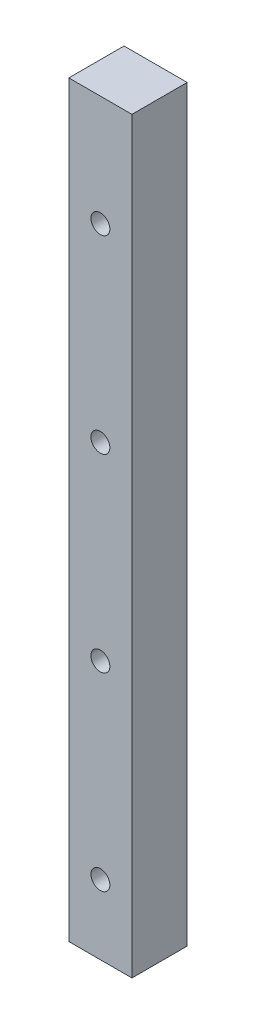
ISO-10303-21;
HEADER;
FILE_DESCRIPTION(('STEP AP214'),'2;1');
FILE_NAME('part.step','',(''),(''),'','','');
FILE_SCHEMA(('AUTOMOTIVE_DESIGN { 1 0 10303 214 1 1 1 1 }'));
ENDSEC;
DATA;
#1=APPLICATION_CONTEXT('core data for automotive mechanical design processes');
#2=APPLICATION_PROTOCOL_DEFINITION('international standard','automotive_design',2000,#1);
#3=PRODUCT_CONTEXT('',#1,'mechanical');
#4=PRODUCT('Part','Part','',(#3));
#5=PRODUCT_RELATED_PRODUCT_CATEGORY('part','',(#4));
#6=PRODUCT_DEFINITION_FORMATION('','',#4);
#7=PRODUCT_DEFINITION_CONTEXT('part definition',#1,'design');
#8=PRODUCT_DEFINITION('design','',#6,#7);
#9=PRODUCT_DEFINITION_SHAPE('','',#8);
#10=(LENGTH_UNIT() NAMED_UNIT(*) SI_UNIT(.MILLI.,.METRE.));
#11=(NAMED_UNIT(*) PLANE_ANGLE_UNIT() SI_UNIT($,.RADIAN.));
#12=(NAMED_UNIT(*) SI_UNIT($,.STERADIAN.) SOLID_ANGLE_UNIT());
#13=UNCERTAINTY_MEASURE_WITH_UNIT(LENGTH_MEASURE(1.E-05),#10,'distance_accuracy_value','');
#14=(GEOMETRIC_REPRESENTATION_CONTEXT(3) GLOBAL_UNCERTAINTY_ASSIGNED_CONTEXT((#13)) GLOBAL_UNIT_ASSIGNED_CONTEXT((#10,
#11,#12)) REPRESENTATION_CONTEXT('',''));
#15=CARTESIAN_POINT('',(0.,0.,0.));
#16=DIRECTION('',(0.,0.,1.));
#17=DIRECTION('',(1.,0.,0.));
#18=AXIS2_PLACEMENT_3D('',#15,#16,#17);
#19=CARTESIAN_POINT('',(-10.,237.,-17.5));
#20=DIRECTION('',(1.,0.,0.));
#21=DIRECTION('',(0.,0.,-1.));
#22=AXIS2_PLACEMENT_3D('',#19,#20,#21);
#23=PLANE('',#22);
#24=DIRECTION('',(0.,0.,1.));
#25=VECTOR('',#24,1.);
#26=CARTESIAN_POINT('',(-10.,0.,-17.5));
#27=LINE('',#26,#25);
#28=CARTESIAN_POINT('',(-10.,0.,-17.5));
#29=VERTEX_POINT('',#28);
#30=CARTESIAN_POINT('',(-10.,0.,0.));
#31=VERTEX_POINT('',#30);
#32=EDGE_CURVE('E101',#29,#31,#27,.T.);
#33=ORIENTED_EDGE('',*,*,#32,.T.);
#34=DIRECTION('',(0.,-1.,0.));
#35=VECTOR('',#34,1.);
#36=CARTESIAN_POINT('',(-10.,237.,0.));
#37=LINE('',#36,#35);
#38=CARTESIAN_POINT('',(-10.,237.,0.));
#39=VERTEX_POINT('',#38);
#40=EDGE_CURVE('E11',#39,#31,#37,.T.);
#41=ORIENTED_EDGE('',*,*,#40,.F.);
#42=DIRECTION('',(0.,0.,1.));
#43=VECTOR('',#42,1.);
#44=CARTESIAN_POINT('',(-10.,237.,-17.5));
#45=LINE('',#44,#43);
#46=CARTESIAN_POINT('',(-10.,237.,-17.5));
#47=VERTEX_POINT('',#46);
#48=EDGE_CURVE('E88',#47,#39,#45,.T.);
#49=ORIENTED_EDGE('',*,*,#48,.F.);
#50=DIRECTION('',(0.,-1.,0.));
#51=VECTOR('',#50,1.);
#52=CARTESIAN_POINT('',(-10.,237.,-17.5));
#53=LINE('',#52,#51);
#54=EDGE_CURVE('E97',#47,#29,#53,.T.);
#55=ORIENTED_EDGE('',*,*,#54,.T.);
#56=EDGE_LOOP('',(#33,#41,#49,#55));
#57=FACE_BOUND('',#56,.T.);
#58=ADVANCED_FACE('F35',(#57),#23,.F.);
#59=CARTESIAN_POINT('',(-10.,237.,0.));
#60=DIRECTION('',(0.,0.,-1.));
#61=DIRECTION('',(-1.,0.,0.));
#62=AXIS2_PLACEMENT_3D('',#59,#60,#61);
#63=PLANE('',#62);
#64=CARTESIAN_POINT('',(0.,22.,0.));
#65=DIRECTION('',(0.,0.,1.));
#66=DIRECTION('',(1.,0.,0.));
#67=AXIS2_PLACEMENT_3D('',#64,#65,#66);
#68=CIRCLE('',#67,3.);
#69=CARTESIAN_POINT('',(3.,22.,0.));
#70=VERTEX_POINT('',#69);
#71=EDGE_CURVE('E104',#70,#70,#68,.T.);
#72=ORIENTED_EDGE('',*,*,#71,.F.);
#73=EDGE_LOOP('',(#72));
#74=FACE_BOUND('',#73,.T.);
#75=CARTESIAN_POINT('',(0.,82.,0.));
#76=DIRECTION('',(0.,0.,1.));
#77=DIRECTION('',(1.,0.,0.));
#78=AXIS2_PLACEMENT_3D('',#75,#76,#77);
#79=CIRCLE('',#78,3.);
#80=CARTESIAN_POINT('',(3.,82.,0.));
#81=VERTEX_POINT('',#80);
#82=EDGE_CURVE('E130',#81,#81,#79,.T.);
#83=ORIENTED_EDGE('',*,*,#82,.F.);
#84=EDGE_LOOP('',(#83));
#85=FACE_BOUND('',#84,.T.);
#86=CARTESIAN_POINT('',(0.,142.,0.));
#87=DIRECTION('',(0.,0.,1.));
#88=DIRECTION('',(1.,0.,0.));
#89=AXIS2_PLACEMENT_3D('',#86,#87,#88);
#90=CIRCLE('',#89,3.);
#91=CARTESIAN_POINT('',(3.,142.,0.));
#92=VERTEX_POINT('',#91);
#93=EDGE_CURVE('E125',#92,#92,#90,.T.);
#94=ORIENTED_EDGE('',*,*,#93,.F.);
#95=EDGE_LOOP('',(#94));
#96=FACE_BOUND('',#95,.T.);
#97=CARTESIAN_POINT('',(0.,202.,0.));
#98=DIRECTION('',(0.,0.,1.));
#99=DIRECTION('',(1.,0.,0.));
#100=AXIS2_PLACEMENT_3D('',#97,#98,#99);
#101=CIRCLE('',#100,3.);
#102=CARTESIAN_POINT('',(3.,202.,0.));
#103=VERTEX_POINT('',#102);
#104=EDGE_CURVE('E121',#103,#103,#101,.T.);
#105=ORIENTED_EDGE('',*,*,#104,.F.);
#106=EDGE_LOOP('',(#105));
#107=FACE_BOUND('',#106,.T.);
#108=DIRECTION('',(1.,0.,0.));
#109=VECTOR('',#108,1.);
#110=CARTESIAN_POINT('',(-10.,0.,0.));
#111=LINE('',#110,#109);
#112=CARTESIAN_POINT('',(10.,0.,0.));
#113=VERTEX_POINT('',#112);
#114=EDGE_CURVE('E92',#31,#113,#111,.T.);
#115=ORIENTED_EDGE('',*,*,#114,.T.);
#116=DIRECTION('',(0.,-1.,0.));
#117=VECTOR('',#116,1.);
#118=CARTESIAN_POINT('',(10.,237.,0.));
#119=LINE('',#118,#117);
#120=CARTESIAN_POINT('',(10.,237.,0.));
#121=VERTEX_POINT('',#120);
#122=EDGE_CURVE('E44',#121,#113,#119,.T.);
#123=ORIENTED_EDGE('',*,*,#122,.F.);
#124=DIRECTION('',(1.,0.,0.));
#125=VECTOR('',#124,1.);
#126=CARTESIAN_POINT('',(-10.,237.,0.));
#127=LINE('',#126,#125);
#128=EDGE_CURVE('E83',#39,#121,#127,.T.);
#129=ORIENTED_EDGE('',*,*,#128,.F.);
#130=ORIENTED_EDGE('',*,*,#40,.T.);
#131=EDGE_LOOP('',(#115,#123,#129,#130));
#132=FACE_BOUND('',#131,.T.);
#133=ADVANCED_FACE('F91',(#74,#85,#96,#107,#132),#63,.F.);
#134=CARTESIAN_POINT('',(9.99999999999999,237.,-17.5));
#135=DIRECTION('',(-1.,0.,0.));
#136=DIRECTION('',(0.,0.,1.));
#137=AXIS2_PLACEMENT_3D('',#134,#135,#136);
#138=PLANE('',#137);
#139=DIRECTION('',(0.,0.,-1.));
#140=VECTOR('',#139,1.);
#141=CARTESIAN_POINT('',(9.99999999999999,0.,-17.5));
#142=LINE('',#141,#140);
#143=CARTESIAN_POINT('',(9.99999999999999,0.,-17.5));
#144=VERTEX_POINT('',#143);
#145=EDGE_CURVE('E70',#113,#144,#142,.T.);
#146=ORIENTED_EDGE('',*,*,#145,.T.);
#147=DIRECTION('',(0.,-1.,0.));
#148=VECTOR('',#147,1.);
#149=CARTESIAN_POINT('',(9.99999999999999,237.,-17.5));
#150=LINE('',#149,#148);
#151=CARTESIAN_POINT('',(9.99999999999999,237.,-17.5));
#152=VERTEX_POINT('',#151);
#153=EDGE_CURVE('E93',#152,#144,#150,.T.);
#154=ORIENTED_EDGE('',*,*,#153,.F.);
#155=DIRECTION('',(0.,0.,-1.));
#156=VECTOR('',#155,1.);
#157=CARTESIAN_POINT('',(9.99999999999999,237.,-17.5));
#158=LINE('',#157,#156);
#159=EDGE_CURVE('E86',#121,#152,#158,.T.);
#160=ORIENTED_EDGE('',*,*,#159,.F.);
#161=ORIENTED_EDGE('',*,*,#122,.T.);
#162=EDGE_LOOP('',(#146,#154,#160,#161));
#163=FACE_BOUND('',#162,.T.);
#164=ADVANCED_FACE('F95',(#163),#138,.F.);
#165=CARTESIAN_POINT('',(-10.,237.,-17.5));
#166=DIRECTION('',(0.,0.,1.));
#167=DIRECTION('',(1.,0.,0.));
#168=AXIS2_PLACEMENT_3D('',#165,#166,#167);
#169=PLANE('',#168);
#170=CARTESIAN_POINT('',(0.,22.,-17.5));
#171=DIRECTION('',(0.,0.,1.));
#172=DIRECTION('',(1.,0.,0.));
#173=AXIS2_PLACEMENT_3D('',#170,#171,#172);
#174=CIRCLE('',#173,4.75);
#175=CARTESIAN_POINT('',(4.75,22.,-17.5));
#176=VERTEX_POINT('',#175);
#177=EDGE_CURVE('E155',#176,#176,#174,.T.);
#178=ORIENTED_EDGE('',*,*,#177,.T.);
#179=EDGE_LOOP('',(#178));
#180=FACE_BOUND('',#179,.T.);
#181=CARTESIAN_POINT('',(0.,82.,-17.5));
#182=DIRECTION('',(0.,0.,1.));
#183=DIRECTION('',(1.,0.,0.));
#184=AXIS2_PLACEMENT_3D('',#181,#182,#183);
#185=CIRCLE('',#184,4.75);
#186=CARTESIAN_POINT('',(4.75,82.,-17.5));
#187=VERTEX_POINT('',#186);
#188=EDGE_CURVE('E149',#187,#187,#185,.T.);
#189=ORIENTED_EDGE('',*,*,#188,.T.);
#190=EDGE_LOOP('',(#189));
#191=FACE_BOUND('',#190,.T.);
#192=CARTESIAN_POINT('',(0.,142.,-17.5));
#193=DIRECTION('',(0.,0.,1.));
#194=DIRECTION('',(1.,0.,0.));
#195=AXIS2_PLACEMENT_3D('',#192,#193,#194);
#196=CIRCLE('',#195,4.75);
#197=CARTESIAN_POINT('',(4.75,142.,-17.5));
#198=VERTEX_POINT('',#197);
#199=EDGE_CURVE('E143',#198,#198,#196,.T.);
#200=ORIENTED_EDGE('',*,*,#199,.T.);
#201=EDGE_LOOP('',(#200));
#202=FACE_BOUND('',#201,.T.);
#203=CARTESIAN_POINT('',(0.,202.,-17.5));
#204=DIRECTION('',(0.,0.,1.));
#205=DIRECTION('',(1.,0.,0.));
#206=AXIS2_PLACEMENT_3D('',#203,#204,#205);
#207=CIRCLE('',#206,4.75);
#208=CARTESIAN_POINT('',(4.75,202.,-17.5));
#209=VERTEX_POINT('',#208);
#210=EDGE_CURVE('E137',#209,#209,#207,.T.);
#211=ORIENTED_EDGE('',*,*,#210,.T.);
#212=EDGE_LOOP('',(#211));
#213=FACE_BOUND('',#212,.T.);
#214=DIRECTION('',(-1.,0.,0.));
#215=VECTOR('',#214,1.);
#216=CARTESIAN_POINT('',(-10.,0.,-17.5));
#217=LINE('',#216,#215);
#218=EDGE_CURVE('E76',#144,#29,#217,.T.);
#219=ORIENTED_EDGE('',*,*,#218,.T.);
#220=ORIENTED_EDGE('',*,*,#54,.F.);
#221=DIRECTION('',(-1.,0.,0.));
#222=VECTOR('',#221,1.);
#223=CARTESIAN_POINT('',(-10.,237.,-17.5));
#224=LINE('',#223,#222);
#225=EDGE_CURVE('E53',#152,#47,#224,.T.);
#226=ORIENTED_EDGE('',*,*,#225,.F.);
#227=ORIENTED_EDGE('',*,*,#153,.T.);
#228=EDGE_LOOP('',(#219,#220,#226,#227));
#229=FACE_BOUND('',#228,.T.);
#230=ADVANCED_FACE('F207',(#180,#191,#202,#213,#229),#169,.F.);
#231=CARTESIAN_POINT('',(0.,237.,0.));
#232=DIRECTION('',(0.,1.,0.));
#233=DIRECTION('',(0.,0.,1.));
#234=AXIS2_PLACEMENT_3D('',#231,#232,#233);
#235=PLANE('',#234);
#236=ORIENTED_EDGE('',*,*,#48,.T.);
#237=ORIENTED_EDGE('',*,*,#128,.T.);
#238=ORIENTED_EDGE('',*,*,#159,.T.);
#239=ORIENTED_EDGE('',*,*,#225,.T.);
#240=EDGE_LOOP('',(#236,#237,#238,#239));
#241=FACE_BOUND('',#240,.T.);
#242=ADVANCED_FACE('F84',(#241),#235,.T.);
#243=CARTESIAN_POINT('',(0.,0.,0.));
#244=DIRECTION('',(0.,1.,0.));
#245=DIRECTION('',(0.,0.,1.));
#246=AXIS2_PLACEMENT_3D('',#243,#244,#245);
#247=PLANE('',#246);
#248=ORIENTED_EDGE('',*,*,#32,.F.);
#249=ORIENTED_EDGE('',*,*,#218,.F.);
#250=ORIENTED_EDGE('',*,*,#145,.F.);
#251=ORIENTED_EDGE('',*,*,#114,.F.);
#252=EDGE_LOOP('',(#248,#249,#250,#251));
#253=FACE_BOUND('',#252,.T.);
#254=ADVANCED_FACE('F194',(#253),#247,.F.);
#255=CARTESIAN_POINT('',(0.,202.,-17.5));
#256=DIRECTION('',(0.,0.,1.));
#257=DIRECTION('',(1.,0.,0.));
#258=AXIS2_PLACEMENT_3D('',#255,#256,#257);
#259=CYLINDRICAL_SURFACE('',#258,3.);
#260=CARTESIAN_POINT('',(0.,202.,-9.));
#261=DIRECTION('',(0.,0.,1.));
#262=DIRECTION('',(1.,0.,0.));
#263=AXIS2_PLACEMENT_3D('',#260,#261,#262);
#264=CIRCLE('',#263,3.);
#265=CARTESIAN_POINT('',(3.,202.,-9.));
#266=VERTEX_POINT('',#265);
#267=EDGE_CURVE('E38',#266,#266,#264,.F.);
#268=ORIENTED_EDGE('',*,*,#267,.T.);
#269=EDGE_LOOP('',(#268));
#270=FACE_BOUND('',#269,.T.);
#271=ORIENTED_EDGE('',*,*,#104,.T.);
#272=EDGE_LOOP('',(#271));
#273=FACE_BOUND('',#272,.T.);
#274=ADVANCED_FACE('F186',(#270,#273),#259,.F.);
#275=CARTESIAN_POINT('',(0.,142.,-17.5));
#276=DIRECTION('',(0.,0.,1.));
#277=DIRECTION('',(1.,0.,0.));
#278=AXIS2_PLACEMENT_3D('',#275,#276,#277);
#279=CYLINDRICAL_SURFACE('',#278,3.);
#280=CARTESIAN_POINT('',(0.,142.,-9.));
#281=DIRECTION('',(0.,0.,1.));
#282=DIRECTION('',(1.,0.,0.));
#283=AXIS2_PLACEMENT_3D('',#280,#281,#282);
#284=CIRCLE('',#283,3.);
#285=CARTESIAN_POINT('',(3.,142.,-9.));
#286=VERTEX_POINT('',#285);
#287=EDGE_CURVE('E116',#286,#286,#284,.F.);
#288=ORIENTED_EDGE('',*,*,#287,.T.);
#289=EDGE_LOOP('',(#288));
#290=FACE_BOUND('',#289,.T.);
#291=ORIENTED_EDGE('',*,*,#93,.T.);
#292=EDGE_LOOP('',(#291));
#293=FACE_BOUND('',#292,.T.);
#294=ADVANCED_FACE('F184',(#290,#293),#279,.F.);
#295=CARTESIAN_POINT('',(0.,82.,-17.5));
#296=DIRECTION('',(0.,0.,1.));
#297=DIRECTION('',(1.,0.,0.));
#298=AXIS2_PLACEMENT_3D('',#295,#296,#297);
#299=CYLINDRICAL_SURFACE('',#298,3.);
#300=CARTESIAN_POINT('',(0.,82.,-9.));
#301=DIRECTION('',(0.,0.,1.));
#302=DIRECTION('',(1.,0.,0.));
#303=AXIS2_PLACEMENT_3D('',#300,#301,#302);
#304=CIRCLE('',#303,3.);
#305=CARTESIAN_POINT('',(3.,82.,-9.));
#306=VERTEX_POINT('',#305);
#307=EDGE_CURVE('E113',#306,#306,#304,.F.);
#308=ORIENTED_EDGE('',*,*,#307,.T.);
#309=EDGE_LOOP('',(#308));
#310=FACE_BOUND('',#309,.T.);
#311=ORIENTED_EDGE('',*,*,#82,.T.);
#312=EDGE_LOOP('',(#311));
#313=FACE_BOUND('',#312,.T.);
#314=ADVANCED_FACE('F173',(#310,#313),#299,.F.);
#315=CARTESIAN_POINT('',(0.,22.,-17.5));
#316=DIRECTION('',(0.,0.,1.));
#317=DIRECTION('',(1.,0.,0.));
#318=AXIS2_PLACEMENT_3D('',#315,#316,#317);
#319=CYLINDRICAL_SURFACE('',#318,3.);
#320=CARTESIAN_POINT('',(0.,22.,-9.));
#321=DIRECTION('',(0.,0.,1.));
#322=DIRECTION('',(1.,0.,0.));
#323=AXIS2_PLACEMENT_3D('',#320,#321,#322);
#324=CIRCLE('',#323,3.);
#325=CARTESIAN_POINT('',(3.,22.,-9.));
#326=VERTEX_POINT('',#325);
#327=EDGE_CURVE('E110',#326,#326,#324,.F.);
#328=ORIENTED_EDGE('',*,*,#327,.T.);
#329=EDGE_LOOP('',(#328));
#330=FACE_BOUND('',#329,.T.);
#331=ORIENTED_EDGE('',*,*,#71,.T.);
#332=EDGE_LOOP('',(#331));
#333=FACE_BOUND('',#332,.T.);
#334=ADVANCED_FACE('F167',(#330,#333),#319,.F.);
#335=CARTESIAN_POINT('',(0.,22.,-9.));
#336=DIRECTION('',(0.,0.,1.));
#337=DIRECTION('',(1.,0.,0.));
#338=AXIS2_PLACEMENT_3D('',#335,#336,#337);
#339=PLANE('',#338);
#340=CARTESIAN_POINT('',(0.,22.,-9.));
#341=DIRECTION('',(0.,0.,1.));
#342=DIRECTION('',(1.,0.,0.));
#343=AXIS2_PLACEMENT_3D('',#340,#341,#342);
#344=CIRCLE('',#343,4.75);
#345=CARTESIAN_POINT('',(4.75,22.,-9.));
#346=VERTEX_POINT('',#345);
#347=EDGE_CURVE('E114',#346,#346,#344,.T.);
#348=ORIENTED_EDGE('',*,*,#347,.F.);
#349=EDGE_LOOP('',(#348));
#350=FACE_BOUND('',#349,.T.);
#351=ORIENTED_EDGE('',*,*,#327,.F.);
#352=EDGE_LOOP('',(#351));
#353=FACE_BOUND('',#352,.T.);
#354=ADVANCED_FACE('F164',(#350,#353),#339,.F.);
#355=CARTESIAN_POINT('',(0.,22.,-9.));
#356=DIRECTION('',(0.,0.,-1.));
#357=DIRECTION('',(-1.,0.,0.));
#358=AXIS2_PLACEMENT_3D('',#355,#356,#357);
#359=CYLINDRICAL_SURFACE('',#358,4.75);
#360=ORIENTED_EDGE('',*,*,#347,.T.);
#361=EDGE_LOOP('',(#360));
#362=FACE_BOUND('',#361,.T.);
#363=ORIENTED_EDGE('',*,*,#177,.F.);
#364=EDGE_LOOP('',(#363));
#365=FACE_BOUND('',#364,.T.);
#366=ADVANCED_FACE('F161',(#362,#365),#359,.F.);
#367=CARTESIAN_POINT('',(0.,82.,-9.));
#368=DIRECTION('',(0.,0.,1.));
#369=DIRECTION('',(1.,0.,0.));
#370=AXIS2_PLACEMENT_3D('',#367,#368,#369);
#371=PLANE('',#370);
#372=CARTESIAN_POINT('',(0.,82.,-9.));
#373=DIRECTION('',(0.,0.,1.));
#374=DIRECTION('',(1.,0.,0.));
#375=AXIS2_PLACEMENT_3D('',#372,#373,#374);
#376=CIRCLE('',#375,4.75);
#377=CARTESIAN_POINT('',(4.75,82.,-9.));
#378=VERTEX_POINT('',#377);
#379=EDGE_CURVE('E152',#378,#378,#376,.T.);
#380=ORIENTED_EDGE('',*,*,#379,.F.);
#381=EDGE_LOOP('',(#380));
#382=FACE_BOUND('',#381,.T.);
#383=ORIENTED_EDGE('',*,*,#307,.F.);
#384=EDGE_LOOP('',(#383));
#385=FACE_BOUND('',#384,.T.);
#386=ADVANCED_FACE('F276',(#382,#385),#371,.F.);
#387=CARTESIAN_POINT('',(0.,82.,-9.));
#388=DIRECTION('',(0.,0.,-1.));
#389=DIRECTION('',(-1.,0.,0.));
#390=AXIS2_PLACEMENT_3D('',#387,#388,#389);
#391=CYLINDRICAL_SURFACE('',#390,4.75);
#392=ORIENTED_EDGE('',*,*,#379,.T.);
#393=EDGE_LOOP('',(#392));
#394=FACE_BOUND('',#393,.T.);
#395=ORIENTED_EDGE('',*,*,#188,.F.);
#396=EDGE_LOOP('',(#395));
#397=FACE_BOUND('',#396,.T.);
#398=ADVANCED_FACE('F284',(#394,#397),#391,.F.);
#399=CARTESIAN_POINT('',(0.,142.,-9.));
#400=DIRECTION('',(0.,0.,1.));
#401=DIRECTION('',(1.,0.,0.));
#402=AXIS2_PLACEMENT_3D('',#399,#400,#401);
#403=PLANE('',#402);
#404=CARTESIAN_POINT('',(0.,142.,-9.));
#405=DIRECTION('',(0.,0.,1.));
#406=DIRECTION('',(1.,0.,0.));
#407=AXIS2_PLACEMENT_3D('',#404,#405,#406);
#408=CIRCLE('',#407,4.75);
#409=CARTESIAN_POINT('',(4.75,142.,-9.));
#410=VERTEX_POINT('',#409);
#411=EDGE_CURVE('E146',#410,#410,#408,.T.);
#412=ORIENTED_EDGE('',*,*,#411,.F.);
#413=EDGE_LOOP('',(#412));
#414=FACE_BOUND('',#413,.T.);
#415=ORIENTED_EDGE('',*,*,#287,.F.);
#416=EDGE_LOOP('',(#415));
#417=FACE_BOUND('',#416,.T.);
#418=ADVANCED_FACE('F293',(#414,#417),#403,.F.);
#419=CARTESIAN_POINT('',(0.,142.,-9.));
#420=DIRECTION('',(0.,0.,-1.));
#421=DIRECTION('',(-1.,0.,0.));
#422=AXIS2_PLACEMENT_3D('',#419,#420,#421);
#423=CYLINDRICAL_SURFACE('',#422,4.75);
#424=ORIENTED_EDGE('',*,*,#411,.T.);
#425=EDGE_LOOP('',(#424));
#426=FACE_BOUND('',#425,.T.);
#427=ORIENTED_EDGE('',*,*,#199,.F.);
#428=EDGE_LOOP('',(#427));
#429=FACE_BOUND('',#428,.T.);
#430=ADVANCED_FACE('F302',(#426,#429),#423,.F.);
#431=CARTESIAN_POINT('',(0.,202.,-9.));
#432=DIRECTION('',(0.,0.,1.));
#433=DIRECTION('',(1.,0.,0.));
#434=AXIS2_PLACEMENT_3D('',#431,#432,#433);
#435=PLANE('',#434);
#436=CARTESIAN_POINT('',(0.,202.,-9.));
#437=DIRECTION('',(0.,0.,1.));
#438=DIRECTION('',(1.,0.,0.));
#439=AXIS2_PLACEMENT_3D('',#436,#437,#438);
#440=CIRCLE('',#439,4.75);
#441=CARTESIAN_POINT('',(4.75,202.,-9.));
#442=VERTEX_POINT('',#441);
#443=EDGE_CURVE('E140',#442,#442,#440,.T.);
#444=ORIENTED_EDGE('',*,*,#443,.F.);
#445=EDGE_LOOP('',(#444));
#446=FACE_BOUND('',#445,.T.);
#447=ORIENTED_EDGE('',*,*,#267,.F.);
#448=EDGE_LOOP('',(#447));
#449=FACE_BOUND('',#448,.T.);
#450=ADVANCED_FACE('F311',(#446,#449),#435,.F.);
#451=CARTESIAN_POINT('',(0.,202.,-9.));
#452=DIRECTION('',(0.,0.,-1.));
#453=DIRECTION('',(-1.,0.,0.));
#454=AXIS2_PLACEMENT_3D('',#451,#452,#453);
#455=CYLINDRICAL_SURFACE('',#454,4.75);
#456=ORIENTED_EDGE('',*,*,#443,.T.);
#457=EDGE_LOOP('',(#456));
#458=FACE_BOUND('',#457,.T.);
#459=ORIENTED_EDGE('',*,*,#210,.F.);
#460=EDGE_LOOP('',(#459));
#461=FACE_BOUND('',#460,.T.);
#462=ADVANCED_FACE('F320',(#458,#461),#455,.F.);
#463=CLOSED_SHELL('',(#58,#133,#164,#230,#242,#254,#274,#294,#314,#334,#354,#366,#386,#398,#418,
#430,#450,#462));
#464=MANIFOLD_SOLID_BREP('B2',#463);
#465=ADVANCED_BREP_SHAPE_REPRESENTATION('',(#18,#464),#14);
#466=SHAPE_DEFINITION_REPRESENTATION(#9,#465);
ENDSEC;
END-ISO-10303-21;
